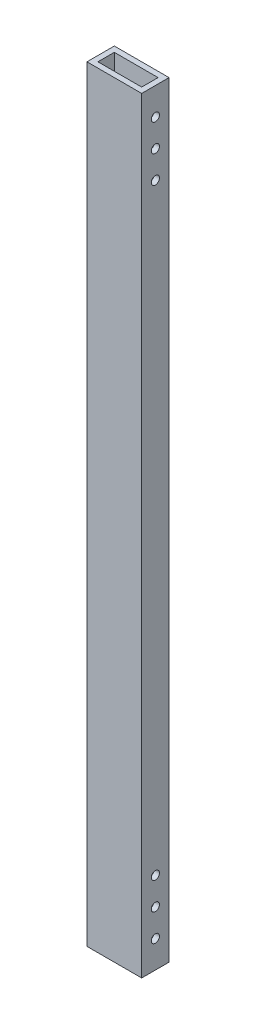
ISO-10303-21;
HEADER;
FILE_DESCRIPTION(('STEP AP214'),'2;1');
FILE_NAME('part.step','',(''),(''),'','','');
FILE_SCHEMA(('AUTOMOTIVE_DESIGN { 1 0 10303 214 1 1 1 1 }'));
ENDSEC;
DATA;
#1=APPLICATION_CONTEXT('core data for automotive mechanical design processes');
#2=APPLICATION_PROTOCOL_DEFINITION('international standard','automotive_design',2000,#1);
#3=PRODUCT_CONTEXT('',#1,'mechanical');
#4=PRODUCT('Part','Part','',(#3));
#5=PRODUCT_RELATED_PRODUCT_CATEGORY('part','',(#4));
#6=PRODUCT_DEFINITION_FORMATION('','',#4);
#7=PRODUCT_DEFINITION_CONTEXT('part definition',#1,'design');
#8=PRODUCT_DEFINITION('design','',#6,#7);
#9=PRODUCT_DEFINITION_SHAPE('','',#8);
#10=(LENGTH_UNIT() NAMED_UNIT(*) SI_UNIT(.MILLI.,.METRE.));
#11=(NAMED_UNIT(*) PLANE_ANGLE_UNIT() SI_UNIT($,.RADIAN.));
#12=(NAMED_UNIT(*) SI_UNIT($,.STERADIAN.) SOLID_ANGLE_UNIT());
#13=UNCERTAINTY_MEASURE_WITH_UNIT(LENGTH_MEASURE(1.E-05),#10,'distance_accuracy_value','');
#14=(GEOMETRIC_REPRESENTATION_CONTEXT(3) GLOBAL_UNCERTAINTY_ASSIGNED_CONTEXT((#13)) GLOBAL_UNIT_ASSIGNED_CONTEXT((#10,
#11,#12)) REPRESENTATION_CONTEXT('',''));
#15=CARTESIAN_POINT('',(0.,0.,0.));
#16=DIRECTION('',(0.,0.,1.));
#17=DIRECTION('',(1.,0.,0.));
#18=AXIS2_PLACEMENT_3D('',#15,#16,#17);
#19=CARTESIAN_POINT('',(0.,140.,0.));
#20=DIRECTION('',(0.,1.,0.));
#21=DIRECTION('',(0.,0.,1.));
#22=AXIS2_PLACEMENT_3D('',#19,#20,#21);
#23=PLANE('',#22);
#24=DIRECTION('',(0.,0.,-1.));
#25=VECTOR('',#24,1.);
#26=CARTESIAN_POINT('',(10.,140.,-5.));
#27=LINE('',#26,#25);
#28=CARTESIAN_POINT('',(10.,140.,5.));
#29=VERTEX_POINT('',#28);
#30=CARTESIAN_POINT('',(10.,140.,-5.));
#31=VERTEX_POINT('',#30);
#32=EDGE_CURVE('E140',#29,#31,#27,.T.);
#33=ORIENTED_EDGE('',*,*,#32,.T.);
#34=DIRECTION('',(-1.,0.,0.));
#35=VECTOR('',#34,1.);
#36=CARTESIAN_POINT('',(-10.,140.,-5.));
#37=LINE('',#36,#35);
#38=CARTESIAN_POINT('',(-10.,140.,-5.));
#39=VERTEX_POINT('',#38);
#40=EDGE_CURVE('E143',#31,#39,#37,.T.);
#41=ORIENTED_EDGE('',*,*,#40,.T.);
#42=DIRECTION('',(0.,0.,1.));
#43=VECTOR('',#42,1.);
#44=CARTESIAN_POINT('',(-10.,140.,-5.));
#45=LINE('',#44,#43);
#46=CARTESIAN_POINT('',(-10.,140.,5.));
#47=VERTEX_POINT('',#46);
#48=EDGE_CURVE('E146',#39,#47,#45,.T.);
#49=ORIENTED_EDGE('',*,*,#48,.T.);
#50=DIRECTION('',(1.,0.,0.));
#51=VECTOR('',#50,1.);
#52=CARTESIAN_POINT('',(-10.,140.,5.));
#53=LINE('',#52,#51);
#54=EDGE_CURVE('E148',#47,#29,#53,.T.);
#55=ORIENTED_EDGE('',*,*,#54,.T.);
#56=EDGE_LOOP('',(#33,#41,#49,#55));
#57=FACE_BOUND('',#56,.T.);
#58=DIRECTION('',(-1.,0.,0.));
#59=VECTOR('',#58,1.);
#60=CARTESIAN_POINT('',(-8.,140.,-3.));
#61=LINE('',#60,#59);
#62=CARTESIAN_POINT('',(8.,140.,-3.));
#63=VERTEX_POINT('',#62);
#64=CARTESIAN_POINT('',(-8.,140.,-3.));
#65=VERTEX_POINT('',#64);
#66=EDGE_CURVE('E110',#63,#65,#61,.T.);
#67=ORIENTED_EDGE('',*,*,#66,.F.);
#68=DIRECTION('',(0.,0.,-1.));
#69=VECTOR('',#68,1.);
#70=CARTESIAN_POINT('',(8.,140.,-3.));
#71=LINE('',#70,#69);
#72=CARTESIAN_POINT('',(8.,140.,3.));
#73=VERTEX_POINT('',#72);
#74=EDGE_CURVE('E102',#73,#63,#71,.T.);
#75=ORIENTED_EDGE('',*,*,#74,.F.);
#76=DIRECTION('',(1.,0.,0.));
#77=VECTOR('',#76,1.);
#78=CARTESIAN_POINT('',(-8.,140.,3.));
#79=LINE('',#78,#77);
#80=CARTESIAN_POINT('',(-8.,140.,3.));
#81=VERTEX_POINT('',#80);
#82=EDGE_CURVE('E124',#81,#73,#79,.T.);
#83=ORIENTED_EDGE('',*,*,#82,.F.);
#84=DIRECTION('',(0.,0.,1.));
#85=VECTOR('',#84,1.);
#86=CARTESIAN_POINT('',(-8.,140.,-3.));
#87=LINE('',#86,#85);
#88=EDGE_CURVE('E122',#65,#81,#87,.T.);
#89=ORIENTED_EDGE('',*,*,#88,.F.);
#90=EDGE_LOOP('',(#67,#75,#83,#89));
#91=FACE_BOUND('',#90,.T.);
#92=ADVANCED_FACE('F35',(#57,#91),#23,.T.);
#93=CARTESIAN_POINT('',(0.,-140.,0.));
#94=DIRECTION('',(0.,1.,0.));
#95=DIRECTION('',(0.,0.,1.));
#96=AXIS2_PLACEMENT_3D('',#93,#94,#95);
#97=PLANE('',#96);
#98=DIRECTION('',(0.,0.,-1.));
#99=VECTOR('',#98,1.);
#100=CARTESIAN_POINT('',(10.,-140.,-5.));
#101=LINE('',#100,#99);
#102=CARTESIAN_POINT('',(10.,-140.,5.));
#103=VERTEX_POINT('',#102);
#104=CARTESIAN_POINT('',(10.,-140.,-5.));
#105=VERTEX_POINT('',#104);
#106=EDGE_CURVE('E118',#103,#105,#101,.T.);
#107=ORIENTED_EDGE('',*,*,#106,.F.);
#108=DIRECTION('',(1.,0.,0.));
#109=VECTOR('',#108,1.);
#110=CARTESIAN_POINT('',(-10.,-140.,5.));
#111=LINE('',#110,#109);
#112=CARTESIAN_POINT('',(-10.,-140.,5.));
#113=VERTEX_POINT('',#112);
#114=EDGE_CURVE('E144',#113,#103,#111,.T.);
#115=ORIENTED_EDGE('',*,*,#114,.F.);
#116=DIRECTION('',(0.,0.,1.));
#117=VECTOR('',#116,1.);
#118=CARTESIAN_POINT('',(-10.,-140.,-5.));
#119=LINE('',#118,#117);
#120=CARTESIAN_POINT('',(-10.,-140.,-5.));
#121=VERTEX_POINT('',#120);
#122=EDGE_CURVE('E155',#121,#113,#119,.T.);
#123=ORIENTED_EDGE('',*,*,#122,.F.);
#124=DIRECTION('',(-1.,0.,0.));
#125=VECTOR('',#124,1.);
#126=CARTESIAN_POINT('',(-10.,-140.,-5.));
#127=LINE('',#126,#125);
#128=EDGE_CURVE('E153',#105,#121,#127,.T.);
#129=ORIENTED_EDGE('',*,*,#128,.F.);
#130=EDGE_LOOP('',(#107,#115,#123,#129));
#131=FACE_BOUND('',#130,.T.);
#132=DIRECTION('',(0.,0.,-1.));
#133=VECTOR('',#132,1.);
#134=CARTESIAN_POINT('',(8.,-140.,-3.));
#135=LINE('',#134,#133);
#136=CARTESIAN_POINT('',(8.,-140.,3.));
#137=VERTEX_POINT('',#136);
#138=CARTESIAN_POINT('',(8.,-140.,-3.));
#139=VERTEX_POINT('',#138);
#140=EDGE_CURVE('E60',#137,#139,#135,.T.);
#141=ORIENTED_EDGE('',*,*,#140,.T.);
#142=DIRECTION('',(-1.,0.,0.));
#143=VECTOR('',#142,1.);
#144=CARTESIAN_POINT('',(-8.,-140.,-3.));
#145=LINE('',#144,#143);
#146=CARTESIAN_POINT('',(-8.,-140.,-3.));
#147=VERTEX_POINT('',#146);
#148=EDGE_CURVE('E117',#139,#147,#145,.T.);
#149=ORIENTED_EDGE('',*,*,#148,.T.);
#150=DIRECTION('',(0.,0.,1.));
#151=VECTOR('',#150,1.);
#152=CARTESIAN_POINT('',(-8.,-140.,-3.));
#153=LINE('',#152,#151);
#154=CARTESIAN_POINT('',(-8.,-140.,3.));
#155=VERTEX_POINT('',#154);
#156=EDGE_CURVE('E132',#147,#155,#153,.T.);
#157=ORIENTED_EDGE('',*,*,#156,.T.);
#158=DIRECTION('',(1.,0.,0.));
#159=VECTOR('',#158,1.);
#160=CARTESIAN_POINT('',(-8.,-140.,3.));
#161=LINE('',#160,#159);
#162=EDGE_CURVE('E111',#155,#137,#161,.T.);
#163=ORIENTED_EDGE('',*,*,#162,.T.);
#164=EDGE_LOOP('',(#141,#149,#157,#163));
#165=FACE_BOUND('',#164,.T.);
#166=ADVANCED_FACE('F219',(#131,#165),#97,.F.);
#167=CARTESIAN_POINT('',(10.,140.,-5.));
#168=DIRECTION('',(-1.,0.,0.));
#169=DIRECTION('',(0.,0.,1.));
#170=AXIS2_PLACEMENT_3D('',#167,#168,#169);
#171=PLANE('',#170);
#172=CARTESIAN_POINT('',(10.,130.,0.));
#173=DIRECTION('',(1.,0.,0.));
#174=DIRECTION('',(0.,0.,-1.));
#175=AXIS2_PLACEMENT_3D('',#172,#173,#174);
#176=CIRCLE('',#175,1.5);
#177=CARTESIAN_POINT('',(10.,130.,-1.5));
#178=VERTEX_POINT('',#177);
#179=EDGE_CURVE('E272',#178,#178,#176,.T.);
#180=ORIENTED_EDGE('',*,*,#179,.F.);
#181=EDGE_LOOP('',(#180));
#182=FACE_BOUND('',#181,.T.);
#183=CARTESIAN_POINT('',(10.,120.,0.));
#184=DIRECTION('',(1.,0.,0.));
#185=DIRECTION('',(0.,0.,-1.));
#186=AXIS2_PLACEMENT_3D('',#183,#184,#185);
#187=CIRCLE('',#186,1.5);
#188=CARTESIAN_POINT('',(10.,120.,-1.5));
#189=VERTEX_POINT('',#188);
#190=EDGE_CURVE('E276',#189,#189,#187,.T.);
#191=ORIENTED_EDGE('',*,*,#190,.F.);
#192=EDGE_LOOP('',(#191));
#193=FACE_BOUND('',#192,.T.);
#194=CARTESIAN_POINT('',(10.,110.,0.));
#195=DIRECTION('',(1.,0.,0.));
#196=DIRECTION('',(0.,0.,-1.));
#197=AXIS2_PLACEMENT_3D('',#194,#195,#196);
#198=CIRCLE('',#197,1.5);
#199=CARTESIAN_POINT('',(10.,110.,-1.5));
#200=VERTEX_POINT('',#199);
#201=EDGE_CURVE('E280',#200,#200,#198,.T.);
#202=ORIENTED_EDGE('',*,*,#201,.F.);
#203=EDGE_LOOP('',(#202));
#204=FACE_BOUND('',#203,.T.);
#205=CARTESIAN_POINT('',(10.,-110.,0.));
#206=DIRECTION('',(1.,0.,0.));
#207=DIRECTION('',(0.,0.,1.));
#208=AXIS2_PLACEMENT_3D('',#205,#206,#207);
#209=CIRCLE('',#208,1.5);
#210=CARTESIAN_POINT('',(10.,-110.,1.5));
#211=VERTEX_POINT('',#210);
#212=EDGE_CURVE('E284',#211,#211,#209,.T.);
#213=ORIENTED_EDGE('',*,*,#212,.F.);
#214=EDGE_LOOP('',(#213));
#215=FACE_BOUND('',#214,.T.);
#216=CARTESIAN_POINT('',(10.,-120.,0.));
#217=DIRECTION('',(1.,0.,0.));
#218=DIRECTION('',(0.,0.,1.));
#219=AXIS2_PLACEMENT_3D('',#216,#217,#218);
#220=CIRCLE('',#219,1.5);
#221=CARTESIAN_POINT('',(10.,-120.,1.5));
#222=VERTEX_POINT('',#221);
#223=EDGE_CURVE('E288',#222,#222,#220,.T.);
#224=ORIENTED_EDGE('',*,*,#223,.F.);
#225=EDGE_LOOP('',(#224));
#226=FACE_BOUND('',#225,.T.);
#227=CARTESIAN_POINT('',(10.,-130.,0.));
#228=DIRECTION('',(1.,0.,0.));
#229=DIRECTION('',(0.,0.,1.));
#230=AXIS2_PLACEMENT_3D('',#227,#228,#229);
#231=CIRCLE('',#230,1.5);
#232=CARTESIAN_POINT('',(10.,-130.,1.5));
#233=VERTEX_POINT('',#232);
#234=EDGE_CURVE('E291',#233,#233,#231,.T.);
#235=ORIENTED_EDGE('',*,*,#234,.F.);
#236=EDGE_LOOP('',(#235));
#237=FACE_BOUND('',#236,.T.);
#238=ORIENTED_EDGE('',*,*,#106,.T.);
#239=DIRECTION('',(0.,-1.,0.));
#240=VECTOR('',#239,1.);
#241=CARTESIAN_POINT('',(10.,140.,-5.));
#242=LINE('',#241,#240);
#243=EDGE_CURVE('E11',#31,#105,#242,.T.);
#244=ORIENTED_EDGE('',*,*,#243,.F.);
#245=ORIENTED_EDGE('',*,*,#32,.F.);
#246=DIRECTION('',(0.,-1.,0.));
#247=VECTOR('',#246,1.);
#248=CARTESIAN_POINT('',(10.,140.,5.));
#249=LINE('',#248,#247);
#250=EDGE_CURVE('E150',#29,#103,#249,.T.);
#251=ORIENTED_EDGE('',*,*,#250,.T.);
#252=EDGE_LOOP('',(#238,#244,#245,#251));
#253=FACE_BOUND('',#252,.T.);
#254=ADVANCED_FACE('F37',(#182,#193,#204,#215,#226,#237,#253),#171,.F.);
#255=CARTESIAN_POINT('',(-10.,140.,-5.));
#256=DIRECTION('',(0.,0.,1.));
#257=DIRECTION('',(1.,0.,0.));
#258=AXIS2_PLACEMENT_3D('',#255,#256,#257);
#259=PLANE('',#258);
#260=ORIENTED_EDGE('',*,*,#128,.T.);
#261=DIRECTION('',(0.,-1.,0.));
#262=VECTOR('',#261,1.);
#263=CARTESIAN_POINT('',(-10.,140.,-5.));
#264=LINE('',#263,#262);
#265=EDGE_CURVE('E44',#39,#121,#264,.T.);
#266=ORIENTED_EDGE('',*,*,#265,.F.);
#267=ORIENTED_EDGE('',*,*,#40,.F.);
#268=ORIENTED_EDGE('',*,*,#243,.T.);
#269=EDGE_LOOP('',(#260,#266,#267,#268));
#270=FACE_BOUND('',#269,.T.);
#271=ADVANCED_FACE('F247',(#270),#259,.F.);
#272=CARTESIAN_POINT('',(-10.,140.,-5.));
#273=DIRECTION('',(1.,0.,0.));
#274=DIRECTION('',(0.,0.,-1.));
#275=AXIS2_PLACEMENT_3D('',#272,#273,#274);
#276=PLANE('',#275);
#277=CARTESIAN_POINT('',(-10.,130.,0.));
#278=DIRECTION('',(1.,0.,0.));
#279=DIRECTION('',(0.,0.,-1.));
#280=AXIS2_PLACEMENT_3D('',#277,#278,#279);
#281=CIRCLE('',#280,1.5);
#282=CARTESIAN_POINT('',(-10.,130.,-1.5));
#283=VERTEX_POINT('',#282);
#284=EDGE_CURVE('E169',#283,#283,#281,.T.);
#285=ORIENTED_EDGE('',*,*,#284,.T.);
#286=EDGE_LOOP('',(#285));
#287=FACE_BOUND('',#286,.T.);
#288=CARTESIAN_POINT('',(-10.,120.,0.));
#289=DIRECTION('',(1.,0.,0.));
#290=DIRECTION('',(0.,0.,-1.));
#291=AXIS2_PLACEMENT_3D('',#288,#289,#290);
#292=CIRCLE('',#291,1.5);
#293=CARTESIAN_POINT('',(-10.,120.,-1.5));
#294=VERTEX_POINT('',#293);
#295=EDGE_CURVE('E346',#294,#294,#292,.T.);
#296=ORIENTED_EDGE('',*,*,#295,.T.);
#297=EDGE_LOOP('',(#296));
#298=FACE_BOUND('',#297,.T.);
#299=CARTESIAN_POINT('',(-10.,110.,0.));
#300=DIRECTION('',(1.,0.,0.));
#301=DIRECTION('',(0.,0.,-1.));
#302=AXIS2_PLACEMENT_3D('',#299,#300,#301);
#303=CIRCLE('',#302,1.5);
#304=CARTESIAN_POINT('',(-10.,110.,-1.5));
#305=VERTEX_POINT('',#304);
#306=EDGE_CURVE('E347',#305,#305,#303,.T.);
#307=ORIENTED_EDGE('',*,*,#306,.T.);
#308=EDGE_LOOP('',(#307));
#309=FACE_BOUND('',#308,.T.);
#310=CARTESIAN_POINT('',(-10.,-110.,0.));
#311=DIRECTION('',(1.,0.,0.));
#312=DIRECTION('',(0.,0.,1.));
#313=AXIS2_PLACEMENT_3D('',#310,#311,#312);
#314=CIRCLE('',#313,1.5);
#315=CARTESIAN_POINT('',(-10.,-110.,1.5));
#316=VERTEX_POINT('',#315);
#317=EDGE_CURVE('E356',#316,#316,#314,.T.);
#318=ORIENTED_EDGE('',*,*,#317,.T.);
#319=EDGE_LOOP('',(#318));
#320=FACE_BOUND('',#319,.T.);
#321=CARTESIAN_POINT('',(-10.,-120.,0.));
#322=DIRECTION('',(1.,0.,0.));
#323=DIRECTION('',(0.,0.,1.));
#324=AXIS2_PLACEMENT_3D('',#321,#322,#323);
#325=CIRCLE('',#324,1.5);
#326=CARTESIAN_POINT('',(-10.,-120.,1.5));
#327=VERTEX_POINT('',#326);
#328=EDGE_CURVE('E360',#327,#327,#325,.T.);
#329=ORIENTED_EDGE('',*,*,#328,.T.);
#330=EDGE_LOOP('',(#329));
#331=FACE_BOUND('',#330,.T.);
#332=CARTESIAN_POINT('',(-10.,-130.,0.));
#333=DIRECTION('',(1.,0.,0.));
#334=DIRECTION('',(0.,0.,1.));
#335=AXIS2_PLACEMENT_3D('',#332,#333,#334);
#336=CIRCLE('',#335,1.5);
#337=CARTESIAN_POINT('',(-10.,-130.,1.5));
#338=VERTEX_POINT('',#337);
#339=EDGE_CURVE('E293',#338,#338,#336,.T.);
#340=ORIENTED_EDGE('',*,*,#339,.T.);
#341=EDGE_LOOP('',(#340));
#342=FACE_BOUND('',#341,.T.);
#343=ORIENTED_EDGE('',*,*,#122,.T.);
#344=DIRECTION('',(0.,-1.,0.));
#345=VECTOR('',#344,1.);
#346=CARTESIAN_POINT('',(-10.,140.,5.));
#347=LINE('',#346,#345);
#348=EDGE_CURVE('E160',#47,#113,#347,.T.);
#349=ORIENTED_EDGE('',*,*,#348,.F.);
#350=ORIENTED_EDGE('',*,*,#48,.F.);
#351=ORIENTED_EDGE('',*,*,#265,.T.);
#352=EDGE_LOOP('',(#343,#349,#350,#351));
#353=FACE_BOUND('',#352,.T.);
#354=ADVANCED_FACE('F244',(#287,#298,#309,#320,#331,#342,#353),#276,.F.);
#355=CARTESIAN_POINT('',(-10.,140.,5.));
#356=DIRECTION('',(0.,0.,-1.));
#357=DIRECTION('',(-1.,0.,0.));
#358=AXIS2_PLACEMENT_3D('',#355,#356,#357);
#359=PLANE('',#358);
#360=ORIENTED_EDGE('',*,*,#114,.T.);
#361=ORIENTED_EDGE('',*,*,#250,.F.);
#362=ORIENTED_EDGE('',*,*,#54,.F.);
#363=ORIENTED_EDGE('',*,*,#348,.T.);
#364=EDGE_LOOP('',(#360,#361,#362,#363));
#365=FACE_BOUND('',#364,.T.);
#366=ADVANCED_FACE('F241',(#365),#359,.F.);
#367=CARTESIAN_POINT('',(8.,140.,-3.));
#368=DIRECTION('',(-1.,0.,0.));
#369=DIRECTION('',(0.,0.,1.));
#370=AXIS2_PLACEMENT_3D('',#367,#368,#369);
#371=PLANE('',#370);
#372=CARTESIAN_POINT('',(8.,130.,0.));
#373=DIRECTION('',(-1.,0.,0.));
#374=DIRECTION('',(0.,0.,1.));
#375=AXIS2_PLACEMENT_3D('',#372,#373,#374);
#376=CIRCLE('',#375,1.5);
#377=CARTESIAN_POINT('',(8.,130.,1.5));
#378=VERTEX_POINT('',#377);
#379=EDGE_CURVE('E130',#378,#378,#376,.T.);
#380=ORIENTED_EDGE('',*,*,#379,.F.);
#381=EDGE_LOOP('',(#380));
#382=FACE_BOUND('',#381,.T.);
#383=CARTESIAN_POINT('',(8.,120.,0.));
#384=DIRECTION('',(-1.,0.,0.));
#385=DIRECTION('',(0.,0.,1.));
#386=AXIS2_PLACEMENT_3D('',#383,#384,#385);
#387=CIRCLE('',#386,1.5);
#388=CARTESIAN_POINT('',(8.,120.,1.5));
#389=VERTEX_POINT('',#388);
#390=EDGE_CURVE('E183',#389,#389,#387,.T.);
#391=ORIENTED_EDGE('',*,*,#390,.F.);
#392=EDGE_LOOP('',(#391));
#393=FACE_BOUND('',#392,.T.);
#394=CARTESIAN_POINT('',(8.,110.,0.));
#395=DIRECTION('',(-1.,0.,0.));
#396=DIRECTION('',(0.,0.,1.));
#397=AXIS2_PLACEMENT_3D('',#394,#395,#396);
#398=CIRCLE('',#397,1.5);
#399=CARTESIAN_POINT('',(8.,110.,1.5));
#400=VERTEX_POINT('',#399);
#401=EDGE_CURVE('E180',#400,#400,#398,.T.);
#402=ORIENTED_EDGE('',*,*,#401,.F.);
#403=EDGE_LOOP('',(#402));
#404=FACE_BOUND('',#403,.T.);
#405=CARTESIAN_POINT('',(8.,-110.,0.));
#406=DIRECTION('',(-1.,0.,0.));
#407=DIRECTION('',(0.,0.,1.));
#408=AXIS2_PLACEMENT_3D('',#405,#406,#407);
#409=CIRCLE('',#408,1.5);
#410=CARTESIAN_POINT('',(8.,-110.,1.5));
#411=VERTEX_POINT('',#410);
#412=EDGE_CURVE('E177',#411,#411,#409,.T.);
#413=ORIENTED_EDGE('',*,*,#412,.F.);
#414=EDGE_LOOP('',(#413));
#415=FACE_BOUND('',#414,.T.);
#416=CARTESIAN_POINT('',(8.,-120.,0.));
#417=DIRECTION('',(-1.,0.,0.));
#418=DIRECTION('',(0.,0.,1.));
#419=AXIS2_PLACEMENT_3D('',#416,#417,#418);
#420=CIRCLE('',#419,1.5);
#421=CARTESIAN_POINT('',(8.,-120.,1.5));
#422=VERTEX_POINT('',#421);
#423=EDGE_CURVE('E173',#422,#422,#420,.T.);
#424=ORIENTED_EDGE('',*,*,#423,.F.);
#425=EDGE_LOOP('',(#424));
#426=FACE_BOUND('',#425,.T.);
#427=CARTESIAN_POINT('',(8.,-130.,0.));
#428=DIRECTION('',(-1.,0.,0.));
#429=DIRECTION('',(0.,0.,1.));
#430=AXIS2_PLACEMENT_3D('',#427,#428,#429);
#431=CIRCLE('',#430,1.5);
#432=CARTESIAN_POINT('',(8.,-130.,1.5));
#433=VERTEX_POINT('',#432);
#434=EDGE_CURVE('E168',#433,#433,#431,.T.);
#435=ORIENTED_EDGE('',*,*,#434,.F.);
#436=EDGE_LOOP('',(#435));
#437=FACE_BOUND('',#436,.T.);
#438=ORIENTED_EDGE('',*,*,#140,.F.);
#439=DIRECTION('',(0.,-1.,0.));
#440=VECTOR('',#439,1.);
#441=CARTESIAN_POINT('',(8.,140.,3.));
#442=LINE('',#441,#440);
#443=EDGE_CURVE('E106',#73,#137,#442,.T.);
#444=ORIENTED_EDGE('',*,*,#443,.F.);
#445=ORIENTED_EDGE('',*,*,#74,.T.);
#446=DIRECTION('',(0.,-1.,0.));
#447=VECTOR('',#446,1.);
#448=CARTESIAN_POINT('',(8.,140.,-3.));
#449=LINE('',#448,#447);
#450=EDGE_CURVE('E105',#63,#139,#449,.T.);
#451=ORIENTED_EDGE('',*,*,#450,.T.);
#452=EDGE_LOOP('',(#438,#444,#445,#451));
#453=FACE_BOUND('',#452,.T.);
#454=ADVANCED_FACE('F104',(#382,#393,#404,#415,#426,#437,#453),#371,.T.);
#455=CARTESIAN_POINT('',(-8.,140.,-3.));
#456=DIRECTION('',(0.,0.,1.));
#457=DIRECTION('',(1.,0.,0.));
#458=AXIS2_PLACEMENT_3D('',#455,#456,#457);
#459=PLANE('',#458);
#460=ORIENTED_EDGE('',*,*,#148,.F.);
#461=ORIENTED_EDGE('',*,*,#450,.F.);
#462=ORIENTED_EDGE('',*,*,#66,.T.);
#463=DIRECTION('',(0.,-1.,0.));
#464=VECTOR('',#463,1.);
#465=CARTESIAN_POINT('',(-8.,140.,-3.));
#466=LINE('',#465,#464);
#467=EDGE_CURVE('E119',#65,#147,#466,.T.);
#468=ORIENTED_EDGE('',*,*,#467,.T.);
#469=EDGE_LOOP('',(#460,#461,#462,#468));
#470=FACE_BOUND('',#469,.T.);
#471=ADVANCED_FACE('F114',(#470),#459,.T.);
#472=CARTESIAN_POINT('',(-8.,140.,-3.));
#473=DIRECTION('',(1.,0.,0.));
#474=DIRECTION('',(0.,0.,-1.));
#475=AXIS2_PLACEMENT_3D('',#472,#473,#474);
#476=PLANE('',#475);
#477=CARTESIAN_POINT('',(-8.,130.,0.));
#478=DIRECTION('',(1.,0.,0.));
#479=DIRECTION('',(0.,0.,-1.));
#480=AXIS2_PLACEMENT_3D('',#477,#478,#479);
#481=CIRCLE('',#480,1.5);
#482=CARTESIAN_POINT('',(-8.,130.,-1.5));
#483=VERTEX_POINT('',#482);
#484=EDGE_CURVE('E39',#483,#483,#481,.T.);
#485=ORIENTED_EDGE('',*,*,#484,.F.);
#486=EDGE_LOOP('',(#485));
#487=FACE_BOUND('',#486,.T.);
#488=CARTESIAN_POINT('',(-8.,120.,0.));
#489=DIRECTION('',(1.,0.,0.));
#490=DIRECTION('',(0.,0.,-1.));
#491=AXIS2_PLACEMENT_3D('',#488,#489,#490);
#492=CIRCLE('',#491,1.5);
#493=CARTESIAN_POINT('',(-8.,120.,-1.5));
#494=VERTEX_POINT('',#493);
#495=EDGE_CURVE('E181',#494,#494,#492,.T.);
#496=ORIENTED_EDGE('',*,*,#495,.F.);
#497=EDGE_LOOP('',(#496));
#498=FACE_BOUND('',#497,.T.);
#499=CARTESIAN_POINT('',(-8.,110.,0.));
#500=DIRECTION('',(1.,0.,0.));
#501=DIRECTION('',(0.,0.,-1.));
#502=AXIS2_PLACEMENT_3D('',#499,#500,#501);
#503=CIRCLE('',#502,1.5);
#504=CARTESIAN_POINT('',(-8.,110.,-1.5));
#505=VERTEX_POINT('',#504);
#506=EDGE_CURVE('E178',#505,#505,#503,.T.);
#507=ORIENTED_EDGE('',*,*,#506,.F.);
#508=EDGE_LOOP('',(#507));
#509=FACE_BOUND('',#508,.T.);
#510=CARTESIAN_POINT('',(-8.,-110.,0.));
#511=DIRECTION('',(1.,0.,0.));
#512=DIRECTION('',(0.,0.,-1.));
#513=AXIS2_PLACEMENT_3D('',#510,#511,#512);
#514=CIRCLE('',#513,1.5);
#515=CARTESIAN_POINT('',(-8.,-110.,-1.5));
#516=VERTEX_POINT('',#515);
#517=EDGE_CURVE('E174',#516,#516,#514,.T.);
#518=ORIENTED_EDGE('',*,*,#517,.F.);
#519=EDGE_LOOP('',(#518));
#520=FACE_BOUND('',#519,.T.);
#521=CARTESIAN_POINT('',(-8.,-120.,0.));
#522=DIRECTION('',(1.,0.,0.));
#523=DIRECTION('',(0.,0.,-1.));
#524=AXIS2_PLACEMENT_3D('',#521,#522,#523);
#525=CIRCLE('',#524,1.5);
#526=CARTESIAN_POINT('',(-8.,-120.,-1.5));
#527=VERTEX_POINT('',#526);
#528=EDGE_CURVE('E170',#527,#527,#525,.T.);
#529=ORIENTED_EDGE('',*,*,#528,.F.);
#530=EDGE_LOOP('',(#529));
#531=FACE_BOUND('',#530,.T.);
#532=CARTESIAN_POINT('',(-8.,-130.,0.));
#533=DIRECTION('',(1.,0.,0.));
#534=DIRECTION('',(0.,0.,-1.));
#535=AXIS2_PLACEMENT_3D('',#532,#533,#534);
#536=CIRCLE('',#535,1.5);
#537=CARTESIAN_POINT('',(-8.,-130.,-1.5));
#538=VERTEX_POINT('',#537);
#539=EDGE_CURVE('E165',#538,#538,#536,.T.);
#540=ORIENTED_EDGE('',*,*,#539,.F.);
#541=EDGE_LOOP('',(#540));
#542=FACE_BOUND('',#541,.T.);
#543=ORIENTED_EDGE('',*,*,#156,.F.);
#544=ORIENTED_EDGE('',*,*,#467,.F.);
#545=ORIENTED_EDGE('',*,*,#88,.T.);
#546=DIRECTION('',(0.,-1.,0.));
#547=VECTOR('',#546,1.);
#548=CARTESIAN_POINT('',(-8.,140.,3.));
#549=LINE('',#548,#547);
#550=EDGE_CURVE('E52',#81,#155,#549,.T.);
#551=ORIENTED_EDGE('',*,*,#550,.T.);
#552=EDGE_LOOP('',(#543,#544,#545,#551));
#553=FACE_BOUND('',#552,.T.);
#554=ADVANCED_FACE('F203',(#487,#498,#509,#520,#531,#542,#553),#476,.T.);
#555=CARTESIAN_POINT('',(-8.,140.,3.));
#556=DIRECTION('',(0.,0.,-1.));
#557=DIRECTION('',(-1.,0.,0.));
#558=AXIS2_PLACEMENT_3D('',#555,#556,#557);
#559=PLANE('',#558);
#560=ORIENTED_EDGE('',*,*,#162,.F.);
#561=ORIENTED_EDGE('',*,*,#550,.F.);
#562=ORIENTED_EDGE('',*,*,#82,.T.);
#563=ORIENTED_EDGE('',*,*,#443,.T.);
#564=EDGE_LOOP('',(#560,#561,#562,#563));
#565=FACE_BOUND('',#564,.T.);
#566=ADVANCED_FACE('F206',(#565),#559,.T.);
#567=CARTESIAN_POINT('',(-10.,-130.,0.));
#568=DIRECTION('',(1.,0.,0.));
#569=DIRECTION('',(0.,0.,-1.));
#570=AXIS2_PLACEMENT_3D('',#567,#568,#569);
#571=CYLINDRICAL_SURFACE('',#570,1.5);
#572=ORIENTED_EDGE('',*,*,#539,.T.);
#573=EDGE_LOOP('',(#572));
#574=FACE_BOUND('',#573,.T.);
#575=ORIENTED_EDGE('',*,*,#339,.F.);
#576=EDGE_LOOP('',(#575));
#577=FACE_BOUND('',#576,.T.);
#578=ADVANCED_FACE('F221',(#574,#577),#571,.F.);
#579=CARTESIAN_POINT('',(-10.,-120.,0.));
#580=DIRECTION('',(1.,0.,0.));
#581=DIRECTION('',(0.,0.,-1.));
#582=AXIS2_PLACEMENT_3D('',#579,#580,#581);
#583=CYLINDRICAL_SURFACE('',#582,1.5);
#584=ORIENTED_EDGE('',*,*,#528,.T.);
#585=EDGE_LOOP('',(#584));
#586=FACE_BOUND('',#585,.T.);
#587=ORIENTED_EDGE('',*,*,#328,.F.);
#588=EDGE_LOOP('',(#587));
#589=FACE_BOUND('',#588,.T.);
#590=ADVANCED_FACE('F226',(#586,#589),#583,.F.);
#591=CARTESIAN_POINT('',(-10.,-110.,0.));
#592=DIRECTION('',(1.,0.,0.));
#593=DIRECTION('',(0.,0.,-1.));
#594=AXIS2_PLACEMENT_3D('',#591,#592,#593);
#595=CYLINDRICAL_SURFACE('',#594,1.5);
#596=ORIENTED_EDGE('',*,*,#517,.T.);
#597=EDGE_LOOP('',(#596));
#598=FACE_BOUND('',#597,.T.);
#599=ORIENTED_EDGE('',*,*,#317,.F.);
#600=EDGE_LOOP('',(#599));
#601=FACE_BOUND('',#600,.T.);
#602=ADVANCED_FACE('F323',(#598,#601),#595,.F.);
#603=CARTESIAN_POINT('',(-10.,110.,0.));
#604=DIRECTION('',(1.,0.,0.));
#605=DIRECTION('',(0.,0.,-1.));
#606=AXIS2_PLACEMENT_3D('',#603,#604,#605);
#607=CYLINDRICAL_SURFACE('',#606,1.5);
#608=ORIENTED_EDGE('',*,*,#506,.T.);
#609=EDGE_LOOP('',(#608));
#610=FACE_BOUND('',#609,.T.);
#611=ORIENTED_EDGE('',*,*,#306,.F.);
#612=EDGE_LOOP('',(#611));
#613=FACE_BOUND('',#612,.T.);
#614=ADVANCED_FACE('F327',(#610,#613),#607,.F.);
#615=CARTESIAN_POINT('',(-10.,120.,0.));
#616=DIRECTION('',(1.,0.,0.));
#617=DIRECTION('',(0.,0.,-1.));
#618=AXIS2_PLACEMENT_3D('',#615,#616,#617);
#619=CYLINDRICAL_SURFACE('',#618,1.5);
#620=ORIENTED_EDGE('',*,*,#495,.T.);
#621=EDGE_LOOP('',(#620));
#622=FACE_BOUND('',#621,.T.);
#623=ORIENTED_EDGE('',*,*,#295,.F.);
#624=EDGE_LOOP('',(#623));
#625=FACE_BOUND('',#624,.T.);
#626=ADVANCED_FACE('F318',(#622,#625),#619,.F.);
#627=CARTESIAN_POINT('',(-10.,130.,0.));
#628=DIRECTION('',(1.,0.,0.));
#629=DIRECTION('',(0.,0.,-1.));
#630=AXIS2_PLACEMENT_3D('',#627,#628,#629);
#631=CYLINDRICAL_SURFACE('',#630,1.5);
#632=ORIENTED_EDGE('',*,*,#484,.T.);
#633=EDGE_LOOP('',(#632));
#634=FACE_BOUND('',#633,.T.);
#635=ORIENTED_EDGE('',*,*,#284,.F.);
#636=EDGE_LOOP('',(#635));
#637=FACE_BOUND('',#636,.T.);
#638=ADVANCED_FACE('F200',(#634,#637),#631,.F.);
#639=ORIENTED_EDGE('',*,*,#434,.T.);
#640=EDGE_LOOP('',(#639));
#641=FACE_BOUND('',#640,.T.);
#642=ORIENTED_EDGE('',*,*,#234,.T.);
#643=EDGE_LOOP('',(#642));
#644=FACE_BOUND('',#643,.T.);
#645=ADVANCED_FACE('F229',(#641,#644),#571,.F.);
#646=ORIENTED_EDGE('',*,*,#423,.T.);
#647=EDGE_LOOP('',(#646));
#648=FACE_BOUND('',#647,.T.);
#649=ORIENTED_EDGE('',*,*,#223,.T.);
#650=EDGE_LOOP('',(#649));
#651=FACE_BOUND('',#650,.T.);
#652=ADVANCED_FACE('F303',(#648,#651),#583,.F.);
#653=ORIENTED_EDGE('',*,*,#412,.T.);
#654=EDGE_LOOP('',(#653));
#655=FACE_BOUND('',#654,.T.);
#656=ORIENTED_EDGE('',*,*,#212,.T.);
#657=EDGE_LOOP('',(#656));
#658=FACE_BOUND('',#657,.T.);
#659=ADVANCED_FACE('F316',(#655,#658),#595,.F.);
#660=ORIENTED_EDGE('',*,*,#401,.T.);
#661=EDGE_LOOP('',(#660));
#662=FACE_BOUND('',#661,.T.);
#663=ORIENTED_EDGE('',*,*,#201,.T.);
#664=EDGE_LOOP('',(#663));
#665=FACE_BOUND('',#664,.T.);
#666=ADVANCED_FACE('F332',(#662,#665),#607,.F.);
#667=ORIENTED_EDGE('',*,*,#390,.T.);
#668=EDGE_LOOP('',(#667));
#669=FACE_BOUND('',#668,.T.);
#670=ORIENTED_EDGE('',*,*,#190,.T.);
#671=EDGE_LOOP('',(#670));
#672=FACE_BOUND('',#671,.T.);
#673=ADVANCED_FACE('F334',(#669,#672),#619,.F.);
#674=ORIENTED_EDGE('',*,*,#379,.T.);
#675=EDGE_LOOP('',(#674));
#676=FACE_BOUND('',#675,.T.);
#677=ORIENTED_EDGE('',*,*,#179,.T.);
#678=EDGE_LOOP('',(#677));
#679=FACE_BOUND('',#678,.T.);
#680=ADVANCED_FACE('F320',(#676,#679),#631,.F.);
#681=CLOSED_SHELL('',(#92,#166,#254,#271,#354,#366,#454,#471,#554,#566,#578,#590,#602,#614,#626,
#638,#645,#652,#659,#666,#673,#680));
#682=MANIFOLD_SOLID_BREP('B2',#681);
#683=ADVANCED_BREP_SHAPE_REPRESENTATION('',(#18,#682),#14);
#684=SHAPE_DEFINITION_REPRESENTATION(#9,#683);
ENDSEC;
END-ISO-10303-21;
